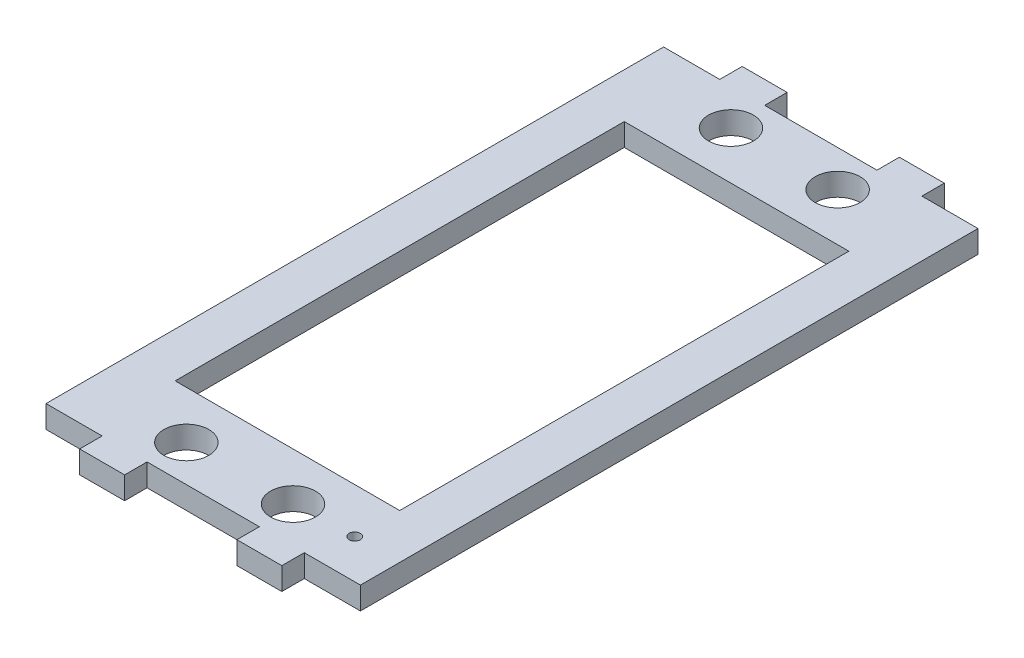
ISO-10303-21;
HEADER;
FILE_DESCRIPTION(('STEP AP214'),'2;1');
FILE_NAME('part.step','',(''),(''),'','','');
FILE_SCHEMA(('AUTOMOTIVE_DESIGN { 1 0 10303 214 1 1 1 1 }'));
ENDSEC;
DATA;
#1=APPLICATION_CONTEXT('core data for automotive mechanical design processes');
#2=APPLICATION_PROTOCOL_DEFINITION('international standard','automotive_design',2000,#1);
#3=PRODUCT_CONTEXT('',#1,'mechanical');
#4=PRODUCT('Part','Part','',(#3));
#5=PRODUCT_RELATED_PRODUCT_CATEGORY('part','',(#4));
#6=PRODUCT_DEFINITION_FORMATION('','',#4);
#7=PRODUCT_DEFINITION_CONTEXT('part definition',#1,'design');
#8=PRODUCT_DEFINITION('design','',#6,#7);
#9=PRODUCT_DEFINITION_SHAPE('','',#8);
#10=(LENGTH_UNIT() NAMED_UNIT(*) SI_UNIT(.MILLI.,.METRE.));
#11=(NAMED_UNIT(*) PLANE_ANGLE_UNIT() SI_UNIT($,.RADIAN.));
#12=(NAMED_UNIT(*) SI_UNIT($,.STERADIAN.) SOLID_ANGLE_UNIT());
#13=UNCERTAINTY_MEASURE_WITH_UNIT(LENGTH_MEASURE(1.E-05),#10,'distance_accuracy_value','');
#14=(GEOMETRIC_REPRESENTATION_CONTEXT(3) GLOBAL_UNCERTAINTY_ASSIGNED_CONTEXT((#13)) GLOBAL_UNIT_ASSIGNED_CONTEXT((#10,
#11,#12)) REPRESENTATION_CONTEXT('',''));
#15=CARTESIAN_POINT('',(0.,0.,0.));
#16=DIRECTION('',(0.,0.,1.));
#17=DIRECTION('',(1.,0.,0.));
#18=AXIS2_PLACEMENT_3D('',#15,#16,#17);
#19=CARTESIAN_POINT('',(0.,2.,0.));
#20=DIRECTION('',(0.,1.,0.));
#21=DIRECTION('',(0.,0.,1.));
#22=AXIS2_PLACEMENT_3D('',#19,#20,#21);
#23=PLANE('',#22);
#24=CARTESIAN_POINT('',(-4.75,2.,-24.25));
#25=DIRECTION('',(0.,1.,0.));
#26=DIRECTION('',(0.,0.,-1.));
#27=AXIS2_PLACEMENT_3D('',#24,#25,#26);
#28=CIRCLE('',#27,2.);
#29=CARTESIAN_POINT('',(-4.75,2.,-26.25));
#30=VERTEX_POINT('',#29);
#31=EDGE_CURVE('E742',#30,#30,#28,.T.);
#32=ORIENTED_EDGE('',*,*,#31,.F.);
#33=EDGE_LOOP('',(#32));
#34=FACE_BOUND('',#33,.T.);
#35=CARTESIAN_POINT('',(4.75,2.,24.25));
#36=DIRECTION('',(0.,1.,0.));
#37=DIRECTION('',(0.,0.,1.));
#38=AXIS2_PLACEMENT_3D('',#35,#36,#37);
#39=CIRCLE('',#38,2.);
#40=CARTESIAN_POINT('',(4.75,2.,26.25));
#41=VERTEX_POINT('',#40);
#42=EDGE_CURVE('E748',#41,#41,#39,.T.);
#43=ORIENTED_EDGE('',*,*,#42,.F.);
#44=EDGE_LOOP('',(#43));
#45=FACE_BOUND('',#44,.T.);
#46=CARTESIAN_POINT('',(-4.75,2.,24.25));
#47=DIRECTION('',(0.,1.,0.));
#48=DIRECTION('',(0.,0.,-1.));
#49=AXIS2_PLACEMENT_3D('',#46,#47,#48);
#50=CIRCLE('',#49,2.);
#51=CARTESIAN_POINT('',(-4.75,2.,22.25));
#52=VERTEX_POINT('',#51);
#53=EDGE_CURVE('E765',#52,#52,#50,.T.);
#54=ORIENTED_EDGE('',*,*,#53,.F.);
#55=EDGE_LOOP('',(#54));
#56=FACE_BOUND('',#55,.T.);
#57=CARTESIAN_POINT('',(10.,2.,24.01));
#58=DIRECTION('',(0.,1.,0.));
#59=DIRECTION('',(0.,0.,1.));
#60=AXIS2_PLACEMENT_3D('',#57,#58,#59);
#61=CIRCLE('',#60,0.500000000000001);
#62=CARTESIAN_POINT('',(10.,2.,24.51));
#63=VERTEX_POINT('',#62);
#64=EDGE_CURVE('E774',#63,#63,#61,.T.);
#65=ORIENTED_EDGE('',*,*,#64,.F.);
#66=EDGE_LOOP('',(#65));
#67=FACE_BOUND('',#66,.T.);
#68=CARTESIAN_POINT('',(4.75,2.,-24.25));
#69=DIRECTION('',(0.,1.,0.));
#70=DIRECTION('',(0.,0.,1.));
#71=AXIS2_PLACEMENT_3D('',#68,#69,#70);
#72=CIRCLE('',#71,2.);
#73=CARTESIAN_POINT('',(4.75,2.,-22.25));
#74=VERTEX_POINT('',#73);
#75=EDGE_CURVE('E745',#74,#74,#72,.T.);
#76=ORIENTED_EDGE('',*,*,#75,.F.);
#77=EDGE_LOOP('',(#76));
#78=FACE_BOUND('',#77,.T.);
#79=DIRECTION('',(-1.,0.,0.));
#80=VECTOR('',#79,1.);
#81=CARTESIAN_POINT('',(9.,2.,-27.5));
#82=LINE('',#81,#80);
#83=CARTESIAN_POINT('',(14.,2.,-27.5));
#84=VERTEX_POINT('',#83);
#85=CARTESIAN_POINT('',(9.,2.,-27.5));
#86=VERTEX_POINT('',#85);
#87=EDGE_CURVE('E232',#84,#86,#82,.T.);
#88=ORIENTED_EDGE('',*,*,#87,.T.);
#89=DIRECTION('',(0.,0.,-1.));
#90=VECTOR('',#89,1.);
#91=CARTESIAN_POINT('',(9.,2.,-27.5));
#92=LINE('',#91,#90);
#93=CARTESIAN_POINT('',(9.,2.,-29.5));
#94=VERTEX_POINT('',#93);
#95=EDGE_CURVE('E235',#86,#94,#92,.T.);
#96=ORIENTED_EDGE('',*,*,#95,.T.);
#97=DIRECTION('',(-1.,0.,0.));
#98=VECTOR('',#97,1.);
#99=CARTESIAN_POINT('',(5.,2.,-29.5));
#100=LINE('',#99,#98);
#101=CARTESIAN_POINT('',(5.,2.,-29.5));
#102=VERTEX_POINT('',#101);
#103=EDGE_CURVE('E238',#94,#102,#100,.T.);
#104=ORIENTED_EDGE('',*,*,#103,.T.);
#105=DIRECTION('',(0.,0.,1.));
#106=VECTOR('',#105,1.);
#107=CARTESIAN_POINT('',(5.,2.,-27.5));
#108=LINE('',#107,#106);
#109=CARTESIAN_POINT('',(5.,2.,-27.5));
#110=VERTEX_POINT('',#109);
#111=EDGE_CURVE('E240',#102,#110,#108,.T.);
#112=ORIENTED_EDGE('',*,*,#111,.T.);
#113=DIRECTION('',(-1.,0.,0.));
#114=VECTOR('',#113,1.);
#115=CARTESIAN_POINT('',(-5.,2.,-27.5));
#116=LINE('',#115,#114);
#117=CARTESIAN_POINT('',(-5.,2.,-27.5));
#118=VERTEX_POINT('',#117);
#119=EDGE_CURVE('E242',#110,#118,#116,.T.);
#120=ORIENTED_EDGE('',*,*,#119,.T.);
#121=DIRECTION('',(0.,0.,-1.));
#122=VECTOR('',#121,1.);
#123=CARTESIAN_POINT('',(-5.,2.,-27.5));
#124=LINE('',#123,#122);
#125=CARTESIAN_POINT('',(-5.,2.,-29.5));
#126=VERTEX_POINT('',#125);
#127=EDGE_CURVE('E244',#118,#126,#124,.T.);
#128=ORIENTED_EDGE('',*,*,#127,.T.);
#129=DIRECTION('',(-1.,0.,0.));
#130=VECTOR('',#129,1.);
#131=CARTESIAN_POINT('',(-5.,2.,-29.5));
#132=LINE('',#131,#130);
#133=CARTESIAN_POINT('',(-9.,2.,-29.5));
#134=VERTEX_POINT('',#133);
#135=EDGE_CURVE('E246',#126,#134,#132,.T.);
#136=ORIENTED_EDGE('',*,*,#135,.T.);
#137=DIRECTION('',(0.,0.,1.));
#138=VECTOR('',#137,1.);
#139=CARTESIAN_POINT('',(-9.,2.,-27.5));
#140=LINE('',#139,#138);
#141=CARTESIAN_POINT('',(-9.,2.,-27.5));
#142=VERTEX_POINT('',#141);
#143=EDGE_CURVE('E248',#134,#142,#140,.T.);
#144=ORIENTED_EDGE('',*,*,#143,.T.);
#145=DIRECTION('',(-1.,0.,0.));
#146=VECTOR('',#145,1.);
#147=CARTESIAN_POINT('',(-14.,2.,-27.5));
#148=LINE('',#147,#146);
#149=CARTESIAN_POINT('',(-14.,2.,-27.5));
#150=VERTEX_POINT('',#149);
#151=EDGE_CURVE('E250',#142,#150,#148,.T.);
#152=ORIENTED_EDGE('',*,*,#151,.T.);
#153=DIRECTION('',(0.,0.,1.));
#154=VECTOR('',#153,1.);
#155=CARTESIAN_POINT('',(-14.,2.,-14.5));
#156=LINE('',#155,#154);
#157=CARTESIAN_POINT('',(-14.,2.,27.5));
#158=VERTEX_POINT('',#157);
#159=EDGE_CURVE('E252',#150,#158,#156,.T.);
#160=ORIENTED_EDGE('',*,*,#159,.T.);
#161=DIRECTION('',(1.,0.,0.));
#162=VECTOR('',#161,1.);
#163=CARTESIAN_POINT('',(-14.,2.,27.5));
#164=LINE('',#163,#162);
#165=CARTESIAN_POINT('',(-9.,2.,27.5));
#166=VERTEX_POINT('',#165);
#167=EDGE_CURVE('E254',#158,#166,#164,.T.);
#168=ORIENTED_EDGE('',*,*,#167,.T.);
#169=DIRECTION('',(0.,0.,1.));
#170=VECTOR('',#169,1.);
#171=CARTESIAN_POINT('',(-9.,2.,27.5));
#172=LINE('',#171,#170);
#173=CARTESIAN_POINT('',(-9.,2.,29.5));
#174=VERTEX_POINT('',#173);
#175=EDGE_CURVE('E256',#166,#174,#172,.T.);
#176=ORIENTED_EDGE('',*,*,#175,.T.);
#177=DIRECTION('',(1.,0.,0.));
#178=VECTOR('',#177,1.);
#179=CARTESIAN_POINT('',(-5.,2.,29.5));
#180=LINE('',#179,#178);
#181=CARTESIAN_POINT('',(-5.,2.,29.5));
#182=VERTEX_POINT('',#181);
#183=EDGE_CURVE('E258',#174,#182,#180,.T.);
#184=ORIENTED_EDGE('',*,*,#183,.T.);
#185=DIRECTION('',(0.,0.,-1.));
#186=VECTOR('',#185,1.);
#187=CARTESIAN_POINT('',(-4.99999999999998,2.,27.5));
#188=LINE('',#187,#186);
#189=CARTESIAN_POINT('',(-4.99999999999998,2.,27.5));
#190=VERTEX_POINT('',#189);
#191=EDGE_CURVE('E260',#182,#190,#188,.T.);
#192=ORIENTED_EDGE('',*,*,#191,.T.);
#193=DIRECTION('',(1.,0.,0.));
#194=VECTOR('',#193,1.);
#195=CARTESIAN_POINT('',(-4.99999999999998,2.,27.5));
#196=LINE('',#195,#194);
#197=CARTESIAN_POINT('',(5.,2.,27.5));
#198=VERTEX_POINT('',#197);
#199=EDGE_CURVE('E262',#190,#198,#196,.T.);
#200=ORIENTED_EDGE('',*,*,#199,.T.);
#201=DIRECTION('',(0.,0.,1.));
#202=VECTOR('',#201,1.);
#203=CARTESIAN_POINT('',(5.,2.,27.5));
#204=LINE('',#203,#202);
#205=CARTESIAN_POINT('',(5.00000000000001,2.,29.5));
#206=VERTEX_POINT('',#205);
#207=EDGE_CURVE('E264',#198,#206,#204,.T.);
#208=ORIENTED_EDGE('',*,*,#207,.T.);
#209=DIRECTION('',(1.,0.,0.));
#210=VECTOR('',#209,1.);
#211=CARTESIAN_POINT('',(5.00000000000001,2.,29.5));
#212=LINE('',#211,#210);
#213=CARTESIAN_POINT('',(9.00000000000001,2.,29.5));
#214=VERTEX_POINT('',#213);
#215=EDGE_CURVE('E266',#206,#214,#212,.T.);
#216=ORIENTED_EDGE('',*,*,#215,.T.);
#217=DIRECTION('',(0.,0.,-1.));
#218=VECTOR('',#217,1.);
#219=CARTESIAN_POINT('',(9.00000000000001,2.,27.5));
#220=LINE('',#219,#218);
#221=CARTESIAN_POINT('',(9.00000000000001,2.,27.5));
#222=VERTEX_POINT('',#221);
#223=EDGE_CURVE('E268',#214,#222,#220,.T.);
#224=ORIENTED_EDGE('',*,*,#223,.T.);
#225=DIRECTION('',(1.,0.,0.));
#226=VECTOR('',#225,1.);
#227=CARTESIAN_POINT('',(9.00000000000001,2.,27.5));
#228=LINE('',#227,#226);
#229=CARTESIAN_POINT('',(14.,2.,27.5));
#230=VERTEX_POINT('',#229);
#231=EDGE_CURVE('E270',#222,#230,#228,.T.);
#232=ORIENTED_EDGE('',*,*,#231,.T.);
#233=DIRECTION('',(0.,0.,-1.));
#234=VECTOR('',#233,1.);
#235=CARTESIAN_POINT('',(14.,2.,27.5));
#236=LINE('',#235,#234);
#237=EDGE_CURVE('E272',#230,#84,#236,.T.);
#238=ORIENTED_EDGE('',*,*,#237,.T.);
#239=EDGE_LOOP('',(#88,#96,#104,#112,#120,#128,#136,#144,#152,#160,#168,#176,#184,#192,#200,
#208,#216,#224,#232,#238));
#240=FACE_BOUND('',#239,.T.);
#241=DIRECTION('',(-1.,0.,0.));
#242=VECTOR('',#241,1.);
#243=CARTESIAN_POINT('',(-10.,2.,-20.));
#244=LINE('',#243,#242);
#245=CARTESIAN_POINT('',(10.,2.,-20.));
#246=VERTEX_POINT('',#245);
#247=CARTESIAN_POINT('',(-10.,2.,-20.));
#248=VERTEX_POINT('',#247);
#249=EDGE_CURVE('E202',#246,#248,#244,.T.);
#250=ORIENTED_EDGE('',*,*,#249,.F.);
#251=DIRECTION('',(0.,0.,-1.));
#252=VECTOR('',#251,1.);
#253=CARTESIAN_POINT('',(10.,2.,20.));
#254=LINE('',#253,#252);
#255=CARTESIAN_POINT('',(10.,2.,20.));
#256=VERTEX_POINT('',#255);
#257=EDGE_CURVE('E194',#256,#246,#254,.T.);
#258=ORIENTED_EDGE('',*,*,#257,.F.);
#259=DIRECTION('',(1.,0.,0.));
#260=VECTOR('',#259,1.);
#261=CARTESIAN_POINT('',(-10.,2.,20.));
#262=LINE('',#261,#260);
#263=CARTESIAN_POINT('',(-10.,2.,20.));
#264=VERTEX_POINT('',#263);
#265=EDGE_CURVE('E216',#264,#256,#262,.T.);
#266=ORIENTED_EDGE('',*,*,#265,.F.);
#267=DIRECTION('',(0.,0.,1.));
#268=VECTOR('',#267,1.);
#269=CARTESIAN_POINT('',(-10.,2.,20.));
#270=LINE('',#269,#268);
#271=EDGE_CURVE('E214',#248,#264,#270,.T.);
#272=ORIENTED_EDGE('',*,*,#271,.F.);
#273=EDGE_LOOP('',(#250,#258,#266,#272));
#274=FACE_BOUND('',#273,.T.);
#275=ADVANCED_FACE('F33',(#34,#45,#56,#67,#78,#240,#274),#23,.T.);
#276=CARTESIAN_POINT('',(0.,0.,0.));
#277=DIRECTION('',(0.,1.,0.));
#278=DIRECTION('',(0.,0.,1.));
#279=AXIS2_PLACEMENT_3D('',#276,#277,#278);
#280=PLANE('',#279);
#281=CARTESIAN_POINT('',(-4.75,0.,-24.25));
#282=DIRECTION('',(0.,1.,0.));
#283=DIRECTION('',(0.,0.,-1.));
#284=AXIS2_PLACEMENT_3D('',#281,#282,#283);
#285=CIRCLE('',#284,2.);
#286=CARTESIAN_POINT('',(-4.75,0.,-26.25));
#287=VERTEX_POINT('',#286);
#288=EDGE_CURVE('E740',#287,#287,#285,.T.);
#289=ORIENTED_EDGE('',*,*,#288,.T.);
#290=EDGE_LOOP('',(#289));
#291=FACE_BOUND('',#290,.T.);
#292=CARTESIAN_POINT('',(4.75,0.,24.25));
#293=DIRECTION('',(0.,1.,0.));
#294=DIRECTION('',(0.,0.,1.));
#295=AXIS2_PLACEMENT_3D('',#292,#293,#294);
#296=CIRCLE('',#295,2.);
#297=CARTESIAN_POINT('',(4.75,0.,26.25));
#298=VERTEX_POINT('',#297);
#299=EDGE_CURVE('E743',#298,#298,#296,.T.);
#300=ORIENTED_EDGE('',*,*,#299,.T.);
#301=EDGE_LOOP('',(#300));
#302=FACE_BOUND('',#301,.T.);
#303=CARTESIAN_POINT('',(-4.75,0.,24.25));
#304=DIRECTION('',(0.,1.,0.));
#305=DIRECTION('',(0.,0.,-1.));
#306=AXIS2_PLACEMENT_3D('',#303,#304,#305);
#307=CIRCLE('',#306,2.);
#308=CARTESIAN_POINT('',(-4.75,0.,22.25));
#309=VERTEX_POINT('',#308);
#310=EDGE_CURVE('E754',#309,#309,#307,.T.);
#311=ORIENTED_EDGE('',*,*,#310,.T.);
#312=EDGE_LOOP('',(#311));
#313=FACE_BOUND('',#312,.T.);
#314=CARTESIAN_POINT('',(10.,0.,24.01));
#315=DIRECTION('',(0.,1.,0.));
#316=DIRECTION('',(0.,0.,1.));
#317=AXIS2_PLACEMENT_3D('',#314,#315,#316);
#318=CIRCLE('',#317,0.500000000000001);
#319=CARTESIAN_POINT('',(10.,0.,24.51));
#320=VERTEX_POINT('',#319);
#321=EDGE_CURVE('E770',#320,#320,#318,.T.);
#322=ORIENTED_EDGE('',*,*,#321,.T.);
#323=EDGE_LOOP('',(#322));
#324=FACE_BOUND('',#323,.T.);
#325=CARTESIAN_POINT('',(4.75,0.,-24.25));
#326=DIRECTION('',(0.,1.,0.));
#327=DIRECTION('',(0.,0.,1.));
#328=AXIS2_PLACEMENT_3D('',#325,#326,#327);
#329=CIRCLE('',#328,2.);
#330=CARTESIAN_POINT('',(4.75,0.,-22.25));
#331=VERTEX_POINT('',#330);
#332=EDGE_CURVE('E222',#331,#331,#329,.T.);
#333=ORIENTED_EDGE('',*,*,#332,.T.);
#334=EDGE_LOOP('',(#333));
#335=FACE_BOUND('',#334,.T.);
#336=DIRECTION('',(-1.,0.,0.));
#337=VECTOR('',#336,1.);
#338=CARTESIAN_POINT('',(9.,0.,-27.5));
#339=LINE('',#338,#337);
#340=CARTESIAN_POINT('',(14.,0.,-27.5));
#341=VERTEX_POINT('',#340);
#342=CARTESIAN_POINT('',(9.,0.,-27.5));
#343=VERTEX_POINT('',#342);
#344=EDGE_CURVE('E210',#341,#343,#339,.T.);
#345=ORIENTED_EDGE('',*,*,#344,.F.);
#346=DIRECTION('',(0.,0.,-1.));
#347=VECTOR('',#346,1.);
#348=CARTESIAN_POINT('',(14.,0.,27.5));
#349=LINE('',#348,#347);
#350=CARTESIAN_POINT('',(14.,0.,27.5));
#351=VERTEX_POINT('',#350);
#352=EDGE_CURVE('E236',#351,#341,#349,.T.);
#353=ORIENTED_EDGE('',*,*,#352,.F.);
#354=DIRECTION('',(1.,0.,0.));
#355=VECTOR('',#354,1.);
#356=CARTESIAN_POINT('',(9.00000000000001,0.,27.5));
#357=LINE('',#356,#355);
#358=CARTESIAN_POINT('',(9.00000000000001,0.,27.5));
#359=VERTEX_POINT('',#358);
#360=EDGE_CURVE('E312',#359,#351,#357,.T.);
#361=ORIENTED_EDGE('',*,*,#360,.F.);
#362=DIRECTION('',(0.,0.,-1.));
#363=VECTOR('',#362,1.);
#364=CARTESIAN_POINT('',(9.00000000000001,0.,27.5));
#365=LINE('',#364,#363);
#366=CARTESIAN_POINT('',(9.00000000000001,0.,29.5));
#367=VERTEX_POINT('',#366);
#368=EDGE_CURVE('E310',#367,#359,#365,.T.);
#369=ORIENTED_EDGE('',*,*,#368,.F.);
#370=DIRECTION('',(1.,0.,0.));
#371=VECTOR('',#370,1.);
#372=CARTESIAN_POINT('',(5.00000000000001,0.,29.5));
#373=LINE('',#372,#371);
#374=CARTESIAN_POINT('',(5.00000000000001,0.,29.5));
#375=VERTEX_POINT('',#374);
#376=EDGE_CURVE('E308',#375,#367,#373,.T.);
#377=ORIENTED_EDGE('',*,*,#376,.F.);
#378=DIRECTION('',(0.,0.,1.));
#379=VECTOR('',#378,1.);
#380=CARTESIAN_POINT('',(5.,0.,27.5));
#381=LINE('',#380,#379);
#382=CARTESIAN_POINT('',(5.,0.,27.5));
#383=VERTEX_POINT('',#382);
#384=EDGE_CURVE('E306',#383,#375,#381,.T.);
#385=ORIENTED_EDGE('',*,*,#384,.F.);
#386=DIRECTION('',(1.,0.,0.));
#387=VECTOR('',#386,1.);
#388=CARTESIAN_POINT('',(-4.99999999999998,0.,27.5));
#389=LINE('',#388,#387);
#390=CARTESIAN_POINT('',(-4.99999999999998,0.,27.5));
#391=VERTEX_POINT('',#390);
#392=EDGE_CURVE('E304',#391,#383,#389,.T.);
#393=ORIENTED_EDGE('',*,*,#392,.F.);
#394=DIRECTION('',(0.,0.,-1.));
#395=VECTOR('',#394,1.);
#396=CARTESIAN_POINT('',(-4.99999999999998,0.,27.5));
#397=LINE('',#396,#395);
#398=CARTESIAN_POINT('',(-5.,0.,29.5));
#399=VERTEX_POINT('',#398);
#400=EDGE_CURVE('E302',#399,#391,#397,.T.);
#401=ORIENTED_EDGE('',*,*,#400,.F.);
#402=DIRECTION('',(1.,0.,0.));
#403=VECTOR('',#402,1.);
#404=CARTESIAN_POINT('',(-5.,0.,29.5));
#405=LINE('',#404,#403);
#406=CARTESIAN_POINT('',(-9.,0.,29.5));
#407=VERTEX_POINT('',#406);
#408=EDGE_CURVE('E300',#407,#399,#405,.T.);
#409=ORIENTED_EDGE('',*,*,#408,.F.);
#410=DIRECTION('',(0.,0.,1.));
#411=VECTOR('',#410,1.);
#412=CARTESIAN_POINT('',(-9.,0.,27.5));
#413=LINE('',#412,#411);
#414=CARTESIAN_POINT('',(-9.,0.,27.5));
#415=VERTEX_POINT('',#414);
#416=EDGE_CURVE('E298',#415,#407,#413,.T.);
#417=ORIENTED_EDGE('',*,*,#416,.F.);
#418=DIRECTION('',(1.,0.,0.));
#419=VECTOR('',#418,1.);
#420=CARTESIAN_POINT('',(-14.,0.,27.5));
#421=LINE('',#420,#419);
#422=CARTESIAN_POINT('',(-14.,0.,27.5));
#423=VERTEX_POINT('',#422);
#424=EDGE_CURVE('E296',#423,#415,#421,.T.);
#425=ORIENTED_EDGE('',*,*,#424,.F.);
#426=DIRECTION('',(0.,0.,1.));
#427=VECTOR('',#426,1.);
#428=CARTESIAN_POINT('',(-14.,0.,14.5));
#429=LINE('',#428,#427);
#430=CARTESIAN_POINT('',(-14.,0.,-27.5));
#431=VERTEX_POINT('',#430);
#432=EDGE_CURVE('E294',#431,#423,#429,.T.);
#433=ORIENTED_EDGE('',*,*,#432,.F.);
#434=DIRECTION('',(-1.,0.,0.));
#435=VECTOR('',#434,1.);
#436=CARTESIAN_POINT('',(-14.,0.,-27.5));
#437=LINE('',#436,#435);
#438=CARTESIAN_POINT('',(-9.,0.,-27.5));
#439=VERTEX_POINT('',#438);
#440=EDGE_CURVE('E291',#439,#431,#437,.T.);
#441=ORIENTED_EDGE('',*,*,#440,.F.);
#442=DIRECTION('',(0.,0.,1.));
#443=VECTOR('',#442,1.);
#444=CARTESIAN_POINT('',(-9.,0.,-27.5));
#445=LINE('',#444,#443);
#446=CARTESIAN_POINT('',(-9.,0.,-29.5));
#447=VERTEX_POINT('',#446);
#448=EDGE_CURVE('E289',#447,#439,#445,.T.);
#449=ORIENTED_EDGE('',*,*,#448,.F.);
#450=DIRECTION('',(-1.,0.,0.));
#451=VECTOR('',#450,1.);
#452=CARTESIAN_POINT('',(-5.,0.,-29.5));
#453=LINE('',#452,#451);
#454=CARTESIAN_POINT('',(-5.,0.,-29.5));
#455=VERTEX_POINT('',#454);
#456=EDGE_CURVE('E287',#455,#447,#453,.T.);
#457=ORIENTED_EDGE('',*,*,#456,.F.);
#458=DIRECTION('',(0.,0.,-1.));
#459=VECTOR('',#458,1.);
#460=CARTESIAN_POINT('',(-5.,0.,-27.5));
#461=LINE('',#460,#459);
#462=CARTESIAN_POINT('',(-5.,0.,-27.5));
#463=VERTEX_POINT('',#462);
#464=EDGE_CURVE('E285',#463,#455,#461,.T.);
#465=ORIENTED_EDGE('',*,*,#464,.F.);
#466=DIRECTION('',(-1.,0.,0.));
#467=VECTOR('',#466,1.);
#468=CARTESIAN_POINT('',(-5.,0.,-27.5));
#469=LINE('',#468,#467);
#470=CARTESIAN_POINT('',(5.,0.,-27.5));
#471=VERTEX_POINT('',#470);
#472=EDGE_CURVE('E283',#471,#463,#469,.T.);
#473=ORIENTED_EDGE('',*,*,#472,.F.);
#474=DIRECTION('',(0.,0.,1.));
#475=VECTOR('',#474,1.);
#476=CARTESIAN_POINT('',(5.,0.,-27.5));
#477=LINE('',#476,#475);
#478=CARTESIAN_POINT('',(5.,0.,-29.5));
#479=VERTEX_POINT('',#478);
#480=EDGE_CURVE('E281',#479,#471,#477,.T.);
#481=ORIENTED_EDGE('',*,*,#480,.F.);
#482=DIRECTION('',(-1.,0.,0.));
#483=VECTOR('',#482,1.);
#484=CARTESIAN_POINT('',(5.,0.,-29.5));
#485=LINE('',#484,#483);
#486=CARTESIAN_POINT('',(9.,0.,-29.5));
#487=VERTEX_POINT('',#486);
#488=EDGE_CURVE('E279',#487,#479,#485,.T.);
#489=ORIENTED_EDGE('',*,*,#488,.F.);
#490=DIRECTION('',(0.,0.,-1.));
#491=VECTOR('',#490,1.);
#492=CARTESIAN_POINT('',(9.,0.,-27.5));
#493=LINE('',#492,#491);
#494=EDGE_CURVE('E277',#343,#487,#493,.T.);
#495=ORIENTED_EDGE('',*,*,#494,.F.);
#496=EDGE_LOOP('',(#345,#353,#361,#369,#377,#385,#393,#401,#409,#417,#425,#433,#441,#449,#457,
#465,#473,#481,#489,#495));
#497=FACE_BOUND('',#496,.T.);
#498=DIRECTION('',(0.,0.,-1.));
#499=VECTOR('',#498,1.);
#500=CARTESIAN_POINT('',(10.,0.,20.));
#501=LINE('',#500,#499);
#502=CARTESIAN_POINT('',(10.,0.,20.));
#503=VERTEX_POINT('',#502);
#504=CARTESIAN_POINT('',(10.,0.,-20.));
#505=VERTEX_POINT('',#504);
#506=EDGE_CURVE('E56',#503,#505,#501,.T.);
#507=ORIENTED_EDGE('',*,*,#506,.T.);
#508=DIRECTION('',(-1.,0.,0.));
#509=VECTOR('',#508,1.);
#510=CARTESIAN_POINT('',(-10.,0.,-20.));
#511=LINE('',#510,#509);
#512=CARTESIAN_POINT('',(-10.,0.,-20.));
#513=VERTEX_POINT('',#512);
#514=EDGE_CURVE('E209',#505,#513,#511,.T.);
#515=ORIENTED_EDGE('',*,*,#514,.T.);
#516=DIRECTION('',(0.,0.,1.));
#517=VECTOR('',#516,1.);
#518=CARTESIAN_POINT('',(-10.,0.,20.));
#519=LINE('',#518,#517);
#520=CARTESIAN_POINT('',(-10.,0.,20.));
#521=VERTEX_POINT('',#520);
#522=EDGE_CURVE('E224',#513,#521,#519,.T.);
#523=ORIENTED_EDGE('',*,*,#522,.T.);
#524=DIRECTION('',(1.,0.,0.));
#525=VECTOR('',#524,1.);
#526=CARTESIAN_POINT('',(-10.,0.,20.));
#527=LINE('',#526,#525);
#528=EDGE_CURVE('E203',#521,#503,#527,.T.);
#529=ORIENTED_EDGE('',*,*,#528,.T.);
#530=EDGE_LOOP('',(#507,#515,#523,#529));
#531=FACE_BOUND('',#530,.T.);
#532=ADVANCED_FACE('F378',(#291,#302,#313,#324,#335,#497,#531),#280,.F.);
#533=CARTESIAN_POINT('',(9.,2.,-27.5));
#534=DIRECTION('',(0.,0.,1.));
#535=DIRECTION('',(1.,0.,0.));
#536=AXIS2_PLACEMENT_3D('',#533,#534,#535);
#537=PLANE('',#536);
#538=ORIENTED_EDGE('',*,*,#344,.T.);
#539=DIRECTION('',(0.,-1.,0.));
#540=VECTOR('',#539,1.);
#541=CARTESIAN_POINT('',(9.,2.,-27.5));
#542=LINE('',#541,#540);
#543=EDGE_CURVE('E11',#86,#343,#542,.T.);
#544=ORIENTED_EDGE('',*,*,#543,.F.);
#545=ORIENTED_EDGE('',*,*,#87,.F.);
#546=DIRECTION('',(0.,-1.,0.));
#547=VECTOR('',#546,1.);
#548=CARTESIAN_POINT('',(14.,2.,-27.5));
#549=LINE('',#548,#547);
#550=EDGE_CURVE('E274',#84,#341,#549,.T.);
#551=ORIENTED_EDGE('',*,*,#550,.T.);
#552=EDGE_LOOP('',(#538,#544,#545,#551));
#553=FACE_BOUND('',#552,.T.);
#554=ADVANCED_FACE('F35',(#553),#537,.F.);
#555=CARTESIAN_POINT('',(9.,2.,-27.5));
#556=DIRECTION('',(-1.,0.,0.));
#557=DIRECTION('',(0.,0.,1.));
#558=AXIS2_PLACEMENT_3D('',#555,#556,#557);
#559=PLANE('',#558);
#560=ORIENTED_EDGE('',*,*,#494,.T.);
#561=DIRECTION('',(0.,-1.,0.));
#562=VECTOR('',#561,1.);
#563=CARTESIAN_POINT('',(9.,2.,-29.5));
#564=LINE('',#563,#562);
#565=EDGE_CURVE('E41',#94,#487,#564,.T.);
#566=ORIENTED_EDGE('',*,*,#565,.F.);
#567=ORIENTED_EDGE('',*,*,#95,.F.);
#568=ORIENTED_EDGE('',*,*,#543,.T.);
#569=EDGE_LOOP('',(#560,#566,#567,#568));
#570=FACE_BOUND('',#569,.T.);
#571=ADVANCED_FACE('F395',(#570),#559,.F.);
#572=CARTESIAN_POINT('',(5.,2.,-29.5));
#573=DIRECTION('',(0.,0.,1.));
#574=DIRECTION('',(1.,0.,0.));
#575=AXIS2_PLACEMENT_3D('',#572,#573,#574);
#576=PLANE('',#575);
#577=ORIENTED_EDGE('',*,*,#488,.T.);
#578=DIRECTION('',(0.,-1.,0.));
#579=VECTOR('',#578,1.);
#580=CARTESIAN_POINT('',(5.,2.,-29.5));
#581=LINE('',#580,#579);
#582=EDGE_CURVE('E365',#102,#479,#581,.T.);
#583=ORIENTED_EDGE('',*,*,#582,.F.);
#584=ORIENTED_EDGE('',*,*,#103,.F.);
#585=ORIENTED_EDGE('',*,*,#565,.T.);
#586=EDGE_LOOP('',(#577,#583,#584,#585));
#587=FACE_BOUND('',#586,.T.);
#588=ADVANCED_FACE('F372',(#587),#576,.F.);
#589=CARTESIAN_POINT('',(5.,2.,-27.5));
#590=DIRECTION('',(1.,0.,0.));
#591=DIRECTION('',(0.,0.,-1.));
#592=AXIS2_PLACEMENT_3D('',#589,#590,#591);
#593=PLANE('',#592);
#594=ORIENTED_EDGE('',*,*,#480,.T.);
#595=DIRECTION('',(0.,-1.,0.));
#596=VECTOR('',#595,1.);
#597=CARTESIAN_POINT('',(5.,2.,-27.5));
#598=LINE('',#597,#596);
#599=EDGE_CURVE('E362',#110,#471,#598,.T.);
#600=ORIENTED_EDGE('',*,*,#599,.F.);
#601=ORIENTED_EDGE('',*,*,#111,.F.);
#602=ORIENTED_EDGE('',*,*,#582,.T.);
#603=EDGE_LOOP('',(#594,#600,#601,#602));
#604=FACE_BOUND('',#603,.T.);
#605=ADVANCED_FACE('F384',(#604),#593,.F.);
#606=CARTESIAN_POINT('',(-5.,2.,-27.5));
#607=DIRECTION('',(0.,0.,1.));
#608=DIRECTION('',(1.,0.,0.));
#609=AXIS2_PLACEMENT_3D('',#606,#607,#608);
#610=PLANE('',#609);
#611=ORIENTED_EDGE('',*,*,#472,.T.);
#612=DIRECTION('',(0.,-1.,0.));
#613=VECTOR('',#612,1.);
#614=CARTESIAN_POINT('',(-5.,2.,-27.5));
#615=LINE('',#614,#613);
#616=EDGE_CURVE('E359',#118,#463,#615,.T.);
#617=ORIENTED_EDGE('',*,*,#616,.F.);
#618=ORIENTED_EDGE('',*,*,#119,.F.);
#619=ORIENTED_EDGE('',*,*,#599,.T.);
#620=EDGE_LOOP('',(#611,#617,#618,#619));
#621=FACE_BOUND('',#620,.T.);
#622=ADVANCED_FACE('F388',(#621),#610,.F.);
#623=CARTESIAN_POINT('',(-5.,2.,-27.5));
#624=DIRECTION('',(-1.,0.,0.));
#625=DIRECTION('',(0.,0.,1.));
#626=AXIS2_PLACEMENT_3D('',#623,#624,#625);
#627=PLANE('',#626);
#628=ORIENTED_EDGE('',*,*,#464,.T.);
#629=DIRECTION('',(0.,-1.,0.));
#630=VECTOR('',#629,1.);
#631=CARTESIAN_POINT('',(-5.,2.,-29.5));
#632=LINE('',#631,#630);
#633=EDGE_CURVE('E356',#126,#455,#632,.T.);
#634=ORIENTED_EDGE('',*,*,#633,.F.);
#635=ORIENTED_EDGE('',*,*,#127,.F.);
#636=ORIENTED_EDGE('',*,*,#616,.T.);
#637=EDGE_LOOP('',(#628,#634,#635,#636));
#638=FACE_BOUND('',#637,.T.);
#639=ADVANCED_FACE('F467',(#638),#627,.F.);
#640=CARTESIAN_POINT('',(-5.,2.,-29.5));
#641=DIRECTION('',(0.,0.,1.));
#642=DIRECTION('',(1.,0.,0.));
#643=AXIS2_PLACEMENT_3D('',#640,#641,#642);
#644=PLANE('',#643);
#645=ORIENTED_EDGE('',*,*,#456,.T.);
#646=DIRECTION('',(0.,-1.,0.));
#647=VECTOR('',#646,1.);
#648=CARTESIAN_POINT('',(-9.,2.,-29.5));
#649=LINE('',#648,#647);
#650=EDGE_CURVE('E353',#134,#447,#649,.T.);
#651=ORIENTED_EDGE('',*,*,#650,.F.);
#652=ORIENTED_EDGE('',*,*,#135,.F.);
#653=ORIENTED_EDGE('',*,*,#633,.T.);
#654=EDGE_LOOP('',(#645,#651,#652,#653));
#655=FACE_BOUND('',#654,.T.);
#656=ADVANCED_FACE('F465',(#655),#644,.F.);
#657=CARTESIAN_POINT('',(-9.,2.,-27.5));
#658=DIRECTION('',(1.,0.,0.));
#659=DIRECTION('',(0.,0.,-1.));
#660=AXIS2_PLACEMENT_3D('',#657,#658,#659);
#661=PLANE('',#660);
#662=ORIENTED_EDGE('',*,*,#448,.T.);
#663=DIRECTION('',(0.,-1.,0.));
#664=VECTOR('',#663,1.);
#665=CARTESIAN_POINT('',(-9.,2.,-27.5));
#666=LINE('',#665,#664);
#667=EDGE_CURVE('E350',#142,#439,#666,.T.);
#668=ORIENTED_EDGE('',*,*,#667,.F.);
#669=ORIENTED_EDGE('',*,*,#143,.F.);
#670=ORIENTED_EDGE('',*,*,#650,.T.);
#671=EDGE_LOOP('',(#662,#668,#669,#670));
#672=FACE_BOUND('',#671,.T.);
#673=ADVANCED_FACE('F460',(#672),#661,.F.);
#674=CARTESIAN_POINT('',(-14.,2.,-27.5));
#675=DIRECTION('',(0.,0.,1.));
#676=DIRECTION('',(1.,0.,0.));
#677=AXIS2_PLACEMENT_3D('',#674,#675,#676);
#678=PLANE('',#677);
#679=ORIENTED_EDGE('',*,*,#440,.T.);
#680=DIRECTION('',(0.,-1.,0.));
#681=VECTOR('',#680,1.);
#682=CARTESIAN_POINT('',(-14.,2.,-27.5));
#683=LINE('',#682,#681);
#684=EDGE_CURVE('E347',#150,#431,#683,.T.);
#685=ORIENTED_EDGE('',*,*,#684,.F.);
#686=ORIENTED_EDGE('',*,*,#151,.F.);
#687=ORIENTED_EDGE('',*,*,#667,.T.);
#688=EDGE_LOOP('',(#679,#685,#686,#687));
#689=FACE_BOUND('',#688,.T.);
#690=ADVANCED_FACE('F455',(#689),#678,.F.);
#691=CARTESIAN_POINT('',(-14.,2.,14.5));
#692=DIRECTION('',(1.,0.,0.));
#693=DIRECTION('',(0.,0.,-1.));
#694=AXIS2_PLACEMENT_3D('',#691,#692,#693);
#695=PLANE('',#694);
#696=ORIENTED_EDGE('',*,*,#432,.T.);
#697=DIRECTION('',(0.,-1.,0.));
#698=VECTOR('',#697,1.);
#699=CARTESIAN_POINT('',(-14.,2.,27.5));
#700=LINE('',#699,#698);
#701=EDGE_CURVE('E344',#158,#423,#700,.T.);
#702=ORIENTED_EDGE('',*,*,#701,.F.);
#703=ORIENTED_EDGE('',*,*,#159,.F.);
#704=ORIENTED_EDGE('',*,*,#684,.T.);
#705=EDGE_LOOP('',(#696,#702,#703,#704));
#706=FACE_BOUND('',#705,.T.);
#707=ADVANCED_FACE('F451',(#706),#695,.F.);
#708=CARTESIAN_POINT('',(-14.,2.,27.5));
#709=DIRECTION('',(0.,0.,-1.));
#710=DIRECTION('',(-1.,0.,0.));
#711=AXIS2_PLACEMENT_3D('',#708,#709,#710);
#712=PLANE('',#711);
#713=ORIENTED_EDGE('',*,*,#424,.T.);
#714=DIRECTION('',(0.,-1.,0.));
#715=VECTOR('',#714,1.);
#716=CARTESIAN_POINT('',(-9.,2.,27.5));
#717=LINE('',#716,#715);
#718=EDGE_CURVE('E341',#166,#415,#717,.T.);
#719=ORIENTED_EDGE('',*,*,#718,.F.);
#720=ORIENTED_EDGE('',*,*,#167,.F.);
#721=ORIENTED_EDGE('',*,*,#701,.T.);
#722=EDGE_LOOP('',(#713,#719,#720,#721));
#723=FACE_BOUND('',#722,.T.);
#724=ADVANCED_FACE('F446',(#723),#712,.F.);
#725=CARTESIAN_POINT('',(-9.,2.,27.5));
#726=DIRECTION('',(1.,0.,0.));
#727=DIRECTION('',(0.,0.,-1.));
#728=AXIS2_PLACEMENT_3D('',#725,#726,#727);
#729=PLANE('',#728);
#730=ORIENTED_EDGE('',*,*,#416,.T.);
#731=DIRECTION('',(0.,-1.,0.));
#732=VECTOR('',#731,1.);
#733=CARTESIAN_POINT('',(-9.,2.,29.5));
#734=LINE('',#733,#732);
#735=EDGE_CURVE('E338',#174,#407,#734,.T.);
#736=ORIENTED_EDGE('',*,*,#735,.F.);
#737=ORIENTED_EDGE('',*,*,#175,.F.);
#738=ORIENTED_EDGE('',*,*,#718,.T.);
#739=EDGE_LOOP('',(#730,#736,#737,#738));
#740=FACE_BOUND('',#739,.T.);
#741=ADVANCED_FACE('F441',(#740),#729,.F.);
#742=CARTESIAN_POINT('',(-5.,2.,29.5));
#743=DIRECTION('',(0.,0.,-1.));
#744=DIRECTION('',(-1.,0.,0.));
#745=AXIS2_PLACEMENT_3D('',#742,#743,#744);
#746=PLANE('',#745);
#747=ORIENTED_EDGE('',*,*,#408,.T.);
#748=DIRECTION('',(0.,-1.,0.));
#749=VECTOR('',#748,1.);
#750=CARTESIAN_POINT('',(-5.,2.,29.5));
#751=LINE('',#750,#749);
#752=EDGE_CURVE('E335',#182,#399,#751,.T.);
#753=ORIENTED_EDGE('',*,*,#752,.F.);
#754=ORIENTED_EDGE('',*,*,#183,.F.);
#755=ORIENTED_EDGE('',*,*,#735,.T.);
#756=EDGE_LOOP('',(#747,#753,#754,#755));
#757=FACE_BOUND('',#756,.T.);
#758=ADVANCED_FACE('F437',(#757),#746,.F.);
#759=CARTESIAN_POINT('',(-4.99999999999998,2.,27.5));
#760=DIRECTION('',(-1.,0.,0.));
#761=DIRECTION('',(0.,0.,1.));
#762=AXIS2_PLACEMENT_3D('',#759,#760,#761);
#763=PLANE('',#762);
#764=ORIENTED_EDGE('',*,*,#400,.T.);
#765=DIRECTION('',(0.,-1.,0.));
#766=VECTOR('',#765,1.);
#767=CARTESIAN_POINT('',(-4.99999999999998,2.,27.5));
#768=LINE('',#767,#766);
#769=EDGE_CURVE('E332',#190,#391,#768,.T.);
#770=ORIENTED_EDGE('',*,*,#769,.F.);
#771=ORIENTED_EDGE('',*,*,#191,.F.);
#772=ORIENTED_EDGE('',*,*,#752,.T.);
#773=EDGE_LOOP('',(#764,#770,#771,#772));
#774=FACE_BOUND('',#773,.T.);
#775=ADVANCED_FACE('F432',(#774),#763,.F.);
#776=CARTESIAN_POINT('',(-4.99999999999998,2.,27.5));
#777=DIRECTION('',(0.,0.,-1.));
#778=DIRECTION('',(-1.,0.,0.));
#779=AXIS2_PLACEMENT_3D('',#776,#777,#778);
#780=PLANE('',#779);
#781=ORIENTED_EDGE('',*,*,#392,.T.);
#782=DIRECTION('',(0.,-1.,0.));
#783=VECTOR('',#782,1.);
#784=CARTESIAN_POINT('',(5.,2.,27.5));
#785=LINE('',#784,#783);
#786=EDGE_CURVE('E329',#198,#383,#785,.T.);
#787=ORIENTED_EDGE('',*,*,#786,.F.);
#788=ORIENTED_EDGE('',*,*,#199,.F.);
#789=ORIENTED_EDGE('',*,*,#769,.T.);
#790=EDGE_LOOP('',(#781,#787,#788,#789));
#791=FACE_BOUND('',#790,.T.);
#792=ADVANCED_FACE('F426',(#791),#780,.F.);
#793=CARTESIAN_POINT('',(5.,2.,27.5));
#794=DIRECTION('',(1.,0.,0.));
#795=DIRECTION('',(0.,0.,-1.));
#796=AXIS2_PLACEMENT_3D('',#793,#794,#795);
#797=PLANE('',#796);
#798=ORIENTED_EDGE('',*,*,#384,.T.);
#799=DIRECTION('',(0.,-1.,0.));
#800=VECTOR('',#799,1.);
#801=CARTESIAN_POINT('',(5.00000000000001,2.,29.5));
#802=LINE('',#801,#800);
#803=EDGE_CURVE('E326',#206,#375,#802,.T.);
#804=ORIENTED_EDGE('',*,*,#803,.F.);
#805=ORIENTED_EDGE('',*,*,#207,.F.);
#806=ORIENTED_EDGE('',*,*,#786,.T.);
#807=EDGE_LOOP('',(#798,#804,#805,#806));
#808=FACE_BOUND('',#807,.T.);
#809=ADVANCED_FACE('F422',(#808),#797,.F.);
#810=CARTESIAN_POINT('',(5.00000000000001,2.,29.5));
#811=DIRECTION('',(0.,0.,-1.));
#812=DIRECTION('',(-1.,0.,0.));
#813=AXIS2_PLACEMENT_3D('',#810,#811,#812);
#814=PLANE('',#813);
#815=ORIENTED_EDGE('',*,*,#376,.T.);
#816=DIRECTION('',(0.,-1.,0.));
#817=VECTOR('',#816,1.);
#818=CARTESIAN_POINT('',(9.00000000000001,2.,29.5));
#819=LINE('',#818,#817);
#820=EDGE_CURVE('E323',#214,#367,#819,.T.);
#821=ORIENTED_EDGE('',*,*,#820,.F.);
#822=ORIENTED_EDGE('',*,*,#215,.F.);
#823=ORIENTED_EDGE('',*,*,#803,.T.);
#824=EDGE_LOOP('',(#815,#821,#822,#823));
#825=FACE_BOUND('',#824,.T.);
#826=ADVANCED_FACE('F417',(#825),#814,.F.);
#827=CARTESIAN_POINT('',(9.00000000000001,2.,27.5));
#828=DIRECTION('',(-1.,0.,0.));
#829=DIRECTION('',(0.,0.,1.));
#830=AXIS2_PLACEMENT_3D('',#827,#828,#829);
#831=PLANE('',#830);
#832=ORIENTED_EDGE('',*,*,#368,.T.);
#833=DIRECTION('',(0.,-1.,0.));
#834=VECTOR('',#833,1.);
#835=CARTESIAN_POINT('',(9.00000000000001,2.,27.5));
#836=LINE('',#835,#834);
#837=EDGE_CURVE('E320',#222,#359,#836,.T.);
#838=ORIENTED_EDGE('',*,*,#837,.F.);
#839=ORIENTED_EDGE('',*,*,#223,.F.);
#840=ORIENTED_EDGE('',*,*,#820,.T.);
#841=EDGE_LOOP('',(#832,#838,#839,#840));
#842=FACE_BOUND('',#841,.T.);
#843=ADVANCED_FACE('F411',(#842),#831,.F.);
#844=CARTESIAN_POINT('',(9.00000000000001,2.,27.5));
#845=DIRECTION('',(0.,0.,-1.));
#846=DIRECTION('',(-1.,0.,0.));
#847=AXIS2_PLACEMENT_3D('',#844,#845,#846);
#848=PLANE('',#847);
#849=ORIENTED_EDGE('',*,*,#360,.T.);
#850=DIRECTION('',(0.,-1.,0.));
#851=VECTOR('',#850,1.);
#852=CARTESIAN_POINT('',(14.,2.,27.5));
#853=LINE('',#852,#851);
#854=EDGE_CURVE('E317',#230,#351,#853,.T.);
#855=ORIENTED_EDGE('',*,*,#854,.F.);
#856=ORIENTED_EDGE('',*,*,#231,.F.);
#857=ORIENTED_EDGE('',*,*,#837,.T.);
#858=EDGE_LOOP('',(#849,#855,#856,#857));
#859=FACE_BOUND('',#858,.T.);
#860=ADVANCED_FACE('F407',(#859),#848,.F.);
#861=CARTESIAN_POINT('',(14.,2.,27.5));
#862=DIRECTION('',(-1.,0.,0.));
#863=DIRECTION('',(0.,0.,1.));
#864=AXIS2_PLACEMENT_3D('',#861,#862,#863);
#865=PLANE('',#864);
#866=ORIENTED_EDGE('',*,*,#352,.T.);
#867=ORIENTED_EDGE('',*,*,#550,.F.);
#868=ORIENTED_EDGE('',*,*,#237,.F.);
#869=ORIENTED_EDGE('',*,*,#854,.T.);
#870=EDGE_LOOP('',(#866,#867,#868,#869));
#871=FACE_BOUND('',#870,.T.);
#872=ADVANCED_FACE('F402',(#871),#865,.F.);
#873=CARTESIAN_POINT('',(10.,2.,20.));
#874=DIRECTION('',(-1.,0.,0.));
#875=DIRECTION('',(0.,0.,1.));
#876=AXIS2_PLACEMENT_3D('',#873,#874,#875);
#877=PLANE('',#876);
#878=ORIENTED_EDGE('',*,*,#506,.F.);
#879=DIRECTION('',(0.,-1.,0.));
#880=VECTOR('',#879,1.);
#881=CARTESIAN_POINT('',(10.,2.,20.));
#882=LINE('',#881,#880);
#883=EDGE_CURVE('E198',#256,#503,#882,.T.);
#884=ORIENTED_EDGE('',*,*,#883,.F.);
#885=ORIENTED_EDGE('',*,*,#257,.T.);
#886=DIRECTION('',(0.,-1.,0.));
#887=VECTOR('',#886,1.);
#888=CARTESIAN_POINT('',(10.,2.,-20.));
#889=LINE('',#888,#887);
#890=EDGE_CURVE('E197',#246,#505,#889,.T.);
#891=ORIENTED_EDGE('',*,*,#890,.T.);
#892=EDGE_LOOP('',(#878,#884,#885,#891));
#893=FACE_BOUND('',#892,.T.);
#894=ADVANCED_FACE('F196',(#893),#877,.T.);
#895=CARTESIAN_POINT('',(-10.,2.,-20.));
#896=DIRECTION('',(0.,0.,1.));
#897=DIRECTION('',(1.,0.,0.));
#898=AXIS2_PLACEMENT_3D('',#895,#896,#897);
#899=PLANE('',#898);
#900=ORIENTED_EDGE('',*,*,#514,.F.);
#901=ORIENTED_EDGE('',*,*,#890,.F.);
#902=ORIENTED_EDGE('',*,*,#249,.T.);
#903=DIRECTION('',(0.,-1.,0.));
#904=VECTOR('',#903,1.);
#905=CARTESIAN_POINT('',(-10.,2.,-20.));
#906=LINE('',#905,#904);
#907=EDGE_CURVE('E211',#248,#513,#906,.T.);
#908=ORIENTED_EDGE('',*,*,#907,.T.);
#909=EDGE_LOOP('',(#900,#901,#902,#908));
#910=FACE_BOUND('',#909,.T.);
#911=ADVANCED_FACE('F206',(#910),#899,.T.);
#912=CARTESIAN_POINT('',(-10.,2.,20.));
#913=DIRECTION('',(1.,0.,0.));
#914=DIRECTION('',(0.,0.,-1.));
#915=AXIS2_PLACEMENT_3D('',#912,#913,#914);
#916=PLANE('',#915);
#917=ORIENTED_EDGE('',*,*,#522,.F.);
#918=ORIENTED_EDGE('',*,*,#907,.F.);
#919=ORIENTED_EDGE('',*,*,#271,.T.);
#920=DIRECTION('',(0.,-1.,0.));
#921=VECTOR('',#920,1.);
#922=CARTESIAN_POINT('',(-10.,2.,20.));
#923=LINE('',#922,#921);
#924=EDGE_CURVE('E48',#264,#521,#923,.T.);
#925=ORIENTED_EDGE('',*,*,#924,.T.);
#926=EDGE_LOOP('',(#917,#918,#919,#925));
#927=FACE_BOUND('',#926,.T.);
#928=ADVANCED_FACE('F577',(#927),#916,.T.);
#929=CARTESIAN_POINT('',(-10.,2.,20.));
#930=DIRECTION('',(0.,0.,-1.));
#931=DIRECTION('',(-1.,0.,0.));
#932=AXIS2_PLACEMENT_3D('',#929,#930,#931);
#933=PLANE('',#932);
#934=ORIENTED_EDGE('',*,*,#528,.F.);
#935=ORIENTED_EDGE('',*,*,#924,.F.);
#936=ORIENTED_EDGE('',*,*,#265,.T.);
#937=ORIENTED_EDGE('',*,*,#883,.T.);
#938=EDGE_LOOP('',(#934,#935,#936,#937));
#939=FACE_BOUND('',#938,.T.);
#940=ADVANCED_FACE('F583',(#939),#933,.T.);
#941=CARTESIAN_POINT('',(4.75,0.,-24.25));
#942=DIRECTION('',(0.,1.,0.));
#943=DIRECTION('',(0.,0.,1.));
#944=AXIS2_PLACEMENT_3D('',#941,#942,#943);
#945=CYLINDRICAL_SURFACE('',#944,2.);
#946=ORIENTED_EDGE('',*,*,#332,.F.);
#947=EDGE_LOOP('',(#946));
#948=FACE_BOUND('',#947,.T.);
#949=ORIENTED_EDGE('',*,*,#75,.T.);
#950=EDGE_LOOP('',(#949));
#951=FACE_BOUND('',#950,.T.);
#952=ADVANCED_FACE('F591',(#948,#951),#945,.F.);
#953=CARTESIAN_POINT('',(10.,0.,24.01));
#954=DIRECTION('',(0.,1.,0.));
#955=DIRECTION('',(0.,0.,1.));
#956=AXIS2_PLACEMENT_3D('',#953,#954,#955);
#957=CYLINDRICAL_SURFACE('',#956,0.500000000000001);
#958=ORIENTED_EDGE('',*,*,#321,.F.);
#959=EDGE_LOOP('',(#958));
#960=FACE_BOUND('',#959,.T.);
#961=ORIENTED_EDGE('',*,*,#64,.T.);
#962=EDGE_LOOP('',(#961));
#963=FACE_BOUND('',#962,.T.);
#964=ADVANCED_FACE('F598',(#960,#963),#957,.F.);
#965=CARTESIAN_POINT('',(-4.75,0.,24.25));
#966=DIRECTION('',(0.,1.,0.));
#967=DIRECTION('',(0.,0.,1.));
#968=AXIS2_PLACEMENT_3D('',#965,#966,#967);
#969=CYLINDRICAL_SURFACE('',#968,2.);
#970=ORIENTED_EDGE('',*,*,#310,.F.);
#971=EDGE_LOOP('',(#970));
#972=FACE_BOUND('',#971,.T.);
#973=ORIENTED_EDGE('',*,*,#53,.T.);
#974=EDGE_LOOP('',(#973));
#975=FACE_BOUND('',#974,.T.);
#976=ADVANCED_FACE('F607',(#972,#975),#969,.F.);
#977=CARTESIAN_POINT('',(4.75,0.,24.25));
#978=DIRECTION('',(0.,1.,0.));
#979=DIRECTION('',(0.,0.,1.));
#980=AXIS2_PLACEMENT_3D('',#977,#978,#979);
#981=CYLINDRICAL_SURFACE('',#980,2.);
#982=ORIENTED_EDGE('',*,*,#299,.F.);
#983=EDGE_LOOP('',(#982));
#984=FACE_BOUND('',#983,.T.);
#985=ORIENTED_EDGE('',*,*,#42,.T.);
#986=EDGE_LOOP('',(#985));
#987=FACE_BOUND('',#986,.T.);
#988=ADVANCED_FACE('F615',(#984,#987),#981,.F.);
#989=CARTESIAN_POINT('',(-4.75,0.,-24.25));
#990=DIRECTION('',(0.,1.,0.));
#991=DIRECTION('',(0.,0.,1.));
#992=AXIS2_PLACEMENT_3D('',#989,#990,#991);
#993=CYLINDRICAL_SURFACE('',#992,2.);
#994=ORIENTED_EDGE('',*,*,#288,.F.);
#995=EDGE_LOOP('',(#994));
#996=FACE_BOUND('',#995,.T.);
#997=ORIENTED_EDGE('',*,*,#31,.T.);
#998=EDGE_LOOP('',(#997));
#999=FACE_BOUND('',#998,.T.);
#1000=ADVANCED_FACE('F623',(#996,#999),#993,.F.);
#1001=CLOSED_SHELL('',(#275,#532,#554,#571,#588,#605,#622,#639,#656,#673,#690,#707,#724,#741,
#758,#775,#792,#809,#826,#843,#860,#872,#894,#911,#928,#940,#952,#964,#976,#988,#1000));
#1002=MANIFOLD_SOLID_BREP('B2',#1001);
#1003=ADVANCED_BREP_SHAPE_REPRESENTATION('',(#18,#1002),#14);
#1004=SHAPE_DEFINITION_REPRESENTATION(#9,#1003);
ENDSEC;
END-ISO-10303-21;
